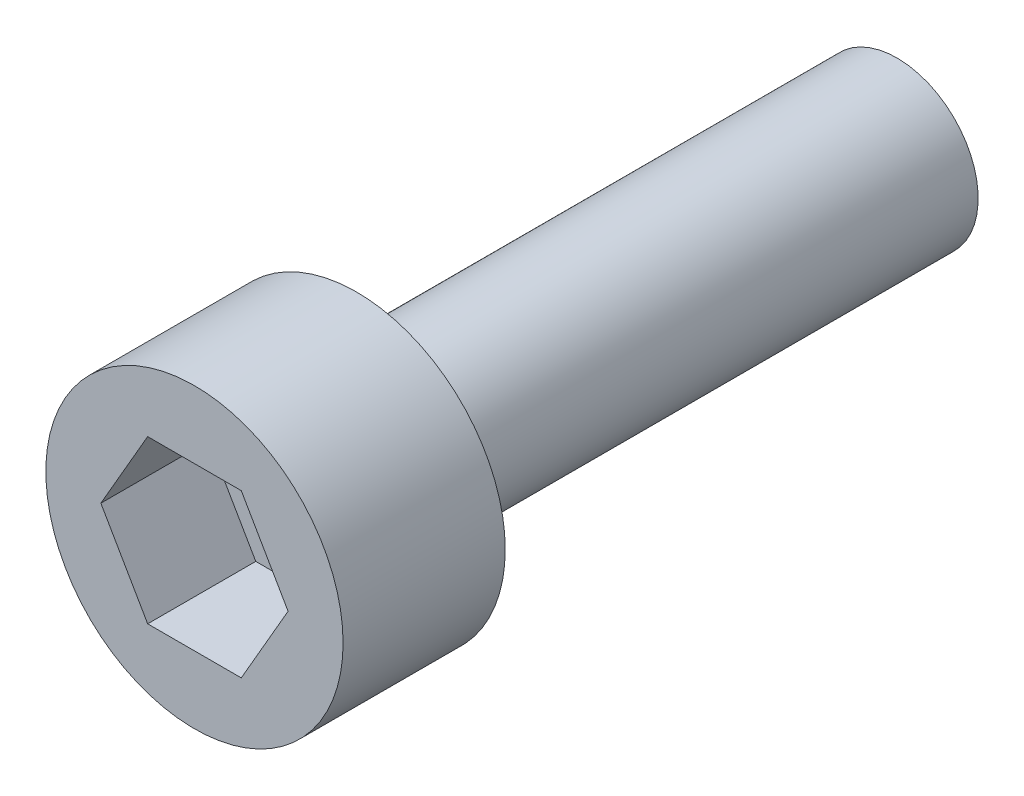
ISO-10303-21;
HEADER;
FILE_DESCRIPTION(('STEP AP214'),'2;1');
FILE_NAME('part.step','',(''),(''),'','','');
FILE_SCHEMA(('AUTOMOTIVE_DESIGN { 1 0 10303 214 1 1 1 1 }'));
ENDSEC;
DATA;
#1=APPLICATION_CONTEXT('core data for automotive mechanical design processes');
#2=APPLICATION_PROTOCOL_DEFINITION('international standard','automotive_design',2000,#1);
#3=PRODUCT_CONTEXT('',#1,'mechanical');
#4=PRODUCT('Part','Part','',(#3));
#5=PRODUCT_RELATED_PRODUCT_CATEGORY('part','',(#4));
#6=PRODUCT_DEFINITION_FORMATION('','',#4);
#7=PRODUCT_DEFINITION_CONTEXT('part definition',#1,'design');
#8=PRODUCT_DEFINITION('design','',#6,#7);
#9=PRODUCT_DEFINITION_SHAPE('','',#8);
#10=(LENGTH_UNIT() NAMED_UNIT(*) SI_UNIT(.MILLI.,.METRE.));
#11=(NAMED_UNIT(*) PLANE_ANGLE_UNIT() SI_UNIT($,.RADIAN.));
#12=(NAMED_UNIT(*) SI_UNIT($,.STERADIAN.) SOLID_ANGLE_UNIT());
#13=UNCERTAINTY_MEASURE_WITH_UNIT(LENGTH_MEASURE(1.E-05),#10,'distance_accuracy_value','');
#14=(GEOMETRIC_REPRESENTATION_CONTEXT(3) GLOBAL_UNCERTAINTY_ASSIGNED_CONTEXT((#13)) GLOBAL_UNIT_ASSIGNED_CONTEXT((#10,
#11,#12)) REPRESENTATION_CONTEXT('',''));
#15=CARTESIAN_POINT('',(0.,0.,0.));
#16=DIRECTION('',(0.,0.,1.));
#17=DIRECTION('',(1.,0.,0.));
#18=AXIS2_PLACEMENT_3D('',#15,#16,#17);
#19=CARTESIAN_POINT('',(0.866025403784438,-1.5,3.));
#20=DIRECTION('',(-0.866025403784439,0.5,0.));
#21=DIRECTION('',(-0.5,-0.866025403784439,0.));
#22=AXIS2_PLACEMENT_3D('',#19,#20,#21);
#23=PLANE('',#22);
#24=DIRECTION('',(0.,0.,-1.));
#25=VECTOR('',#24,1.);
#26=CARTESIAN_POINT('',(1.73205080756888,0.,3.));
#27=LINE('',#26,#25);
#28=CARTESIAN_POINT('',(1.73205080756888,0.,3.));
#29=VERTEX_POINT('',#28);
#30=CARTESIAN_POINT('',(1.73205080756888,0.,1.));
#31=VERTEX_POINT('',#30);
#32=EDGE_CURVE('E119',#29,#31,#27,.T.);
#33=ORIENTED_EDGE('',*,*,#32,.T.);
#34=DIRECTION('',(-0.5,-0.866025403784439,0.));
#35=VECTOR('',#34,1.);
#36=CARTESIAN_POINT('',(1.29903810567666,-0.75,1.));
#37=LINE('',#36,#35);
#38=CARTESIAN_POINT('',(0.866025403784438,-1.5,1.));
#39=VERTEX_POINT('',#38);
#40=EDGE_CURVE('E180',#31,#39,#37,.T.);
#41=ORIENTED_EDGE('',*,*,#40,.T.);
#42=DIRECTION('',(0.,0.,-1.));
#43=VECTOR('',#42,1.);
#44=CARTESIAN_POINT('',(0.866025403784438,-1.5,3.));
#45=LINE('',#44,#43);
#46=CARTESIAN_POINT('',(0.866025403784438,-1.5,3.));
#47=VERTEX_POINT('',#46);
#48=EDGE_CURVE('E197',#47,#39,#45,.T.);
#49=ORIENTED_EDGE('',*,*,#48,.F.);
#50=DIRECTION('',(0.5,0.866025403784439,0.));
#51=VECTOR('',#50,1.);
#52=CARTESIAN_POINT('',(0.866025403784438,-1.5,3.));
#53=LINE('',#52,#51);
#54=EDGE_CURVE('E186',#47,#29,#53,.T.);
#55=ORIENTED_EDGE('',*,*,#54,.T.);
#56=EDGE_LOOP('',(#33,#41,#49,#55));
#57=FACE_BOUND('',#56,.T.);
#58=ADVANCED_FACE('F40',(#57),#23,.T.);
#59=CARTESIAN_POINT('',(1.73205080756888,0.,3.));
#60=DIRECTION('',(-0.866025403784438,-0.5,0.));
#61=DIRECTION('',(0.5,-0.866025403784439,0.));
#62=AXIS2_PLACEMENT_3D('',#59,#60,#61);
#63=PLANE('',#62);
#64=DIRECTION('',(0.,0.,-1.));
#65=VECTOR('',#64,1.);
#66=CARTESIAN_POINT('',(0.866025403784438,1.5,3.));
#67=LINE('',#66,#65);
#68=CARTESIAN_POINT('',(0.866025403784438,1.5,3.));
#69=VERTEX_POINT('',#68);
#70=CARTESIAN_POINT('',(0.866025403784438,1.5,1.));
#71=VERTEX_POINT('',#70);
#72=EDGE_CURVE('E117',#69,#71,#67,.T.);
#73=ORIENTED_EDGE('',*,*,#72,.T.);
#74=DIRECTION('',(0.5,-0.866025403784438,0.));
#75=VECTOR('',#74,1.);
#76=CARTESIAN_POINT('',(1.29903810567666,0.750000000000001,1.));
#77=LINE('',#76,#75);
#78=EDGE_CURVE('E98',#71,#31,#77,.T.);
#79=ORIENTED_EDGE('',*,*,#78,.T.);
#80=ORIENTED_EDGE('',*,*,#32,.F.);
#81=DIRECTION('',(-0.5,0.866025403784438,0.));
#82=VECTOR('',#81,1.);
#83=CARTESIAN_POINT('',(1.73205080756888,0.,3.));
#84=LINE('',#83,#82);
#85=EDGE_CURVE('E188',#29,#69,#84,.T.);
#86=ORIENTED_EDGE('',*,*,#85,.T.);
#87=EDGE_LOOP('',(#73,#79,#80,#86));
#88=FACE_BOUND('',#87,.T.);
#89=ADVANCED_FACE('F145',(#88),#63,.T.);
#90=CARTESIAN_POINT('',(0.866025403784438,1.5,3.));
#91=DIRECTION('',(0.,-1.,0.));
#92=DIRECTION('',(0.,0.,-1.));
#93=AXIS2_PLACEMENT_3D('',#90,#91,#92);
#94=PLANE('',#93);
#95=DIRECTION('',(0.,0.,-1.));
#96=VECTOR('',#95,1.);
#97=CARTESIAN_POINT('',(-0.866025403784439,1.5,3.));
#98=LINE('',#97,#96);
#99=CARTESIAN_POINT('',(-0.866025403784439,1.5,3.));
#100=VERTEX_POINT('',#99);
#101=CARTESIAN_POINT('',(-0.866025403784439,1.5,1.));
#102=VERTEX_POINT('',#101);
#103=EDGE_CURVE('E108',#100,#102,#98,.T.);
#104=ORIENTED_EDGE('',*,*,#103,.T.);
#105=DIRECTION('',(1.,0.,0.));
#106=VECTOR('',#105,1.);
#107=CARTESIAN_POINT('',(0.,1.5,1.));
#108=LINE('',#107,#106);
#109=EDGE_CURVE('E93',#102,#71,#108,.T.);
#110=ORIENTED_EDGE('',*,*,#109,.T.);
#111=ORIENTED_EDGE('',*,*,#72,.F.);
#112=DIRECTION('',(-1.,0.,0.));
#113=VECTOR('',#112,1.);
#114=CARTESIAN_POINT('',(0.866025403784438,1.5,3.));
#115=LINE('',#114,#113);
#116=EDGE_CURVE('E116',#69,#100,#115,.T.);
#117=ORIENTED_EDGE('',*,*,#116,.T.);
#118=EDGE_LOOP('',(#104,#110,#111,#117));
#119=FACE_BOUND('',#118,.T.);
#120=ADVANCED_FACE('F114',(#119),#94,.T.);
#121=CARTESIAN_POINT('',(-0.866025403784439,1.5,3.));
#122=DIRECTION('',(0.866025403784438,-0.5,0.));
#123=DIRECTION('',(0.5,0.866025403784439,0.));
#124=AXIS2_PLACEMENT_3D('',#121,#122,#123);
#125=PLANE('',#124);
#126=DIRECTION('',(0.,0.,-1.));
#127=VECTOR('',#126,1.);
#128=CARTESIAN_POINT('',(-1.73205080756888,0.,3.));
#129=LINE('',#128,#127);
#130=CARTESIAN_POINT('',(-1.73205080756888,0.,3.));
#131=VERTEX_POINT('',#130);
#132=CARTESIAN_POINT('',(-1.73205080756888,0.,1.));
#133=VERTEX_POINT('',#132);
#134=EDGE_CURVE('E111',#131,#133,#129,.T.);
#135=ORIENTED_EDGE('',*,*,#134,.T.);
#136=DIRECTION('',(0.5,0.866025403784439,0.));
#137=VECTOR('',#136,1.);
#138=CARTESIAN_POINT('',(-1.29903810567666,0.75,1.));
#139=LINE('',#138,#137);
#140=EDGE_CURVE('E96',#133,#102,#139,.T.);
#141=ORIENTED_EDGE('',*,*,#140,.T.);
#142=ORIENTED_EDGE('',*,*,#103,.F.);
#143=DIRECTION('',(-0.5,-0.866025403784439,0.));
#144=VECTOR('',#143,1.);
#145=CARTESIAN_POINT('',(-0.866025403784439,1.5,3.));
#146=LINE('',#145,#144);
#147=EDGE_CURVE('E191',#100,#131,#146,.T.);
#148=ORIENTED_EDGE('',*,*,#147,.T.);
#149=EDGE_LOOP('',(#135,#141,#142,#148));
#150=FACE_BOUND('',#149,.T.);
#151=ADVANCED_FACE('F107',(#150),#125,.T.);
#152=CARTESIAN_POINT('',(-1.73205080756888,0.,3.));
#153=DIRECTION('',(0.866025403784439,0.5,0.));
#154=DIRECTION('',(-0.5,0.866025403784439,0.));
#155=AXIS2_PLACEMENT_3D('',#152,#153,#154);
#156=PLANE('',#155);
#157=DIRECTION('',(0.,0.,-1.));
#158=VECTOR('',#157,1.);
#159=CARTESIAN_POINT('',(-0.866025403784438,-1.5,3.));
#160=LINE('',#159,#158);
#161=CARTESIAN_POINT('',(-0.866025403784438,-1.5,3.));
#162=VERTEX_POINT('',#161);
#163=CARTESIAN_POINT('',(-0.866025403784438,-1.5,1.));
#164=VERTEX_POINT('',#163);
#165=EDGE_CURVE('E64',#162,#164,#160,.T.);
#166=ORIENTED_EDGE('',*,*,#165,.T.);
#167=DIRECTION('',(-0.5,0.866025403784439,0.));
#168=VECTOR('',#167,1.);
#169=CARTESIAN_POINT('',(-1.29903810567666,-0.75,1.));
#170=LINE('',#169,#168);
#171=EDGE_CURVE('E57',#164,#133,#170,.T.);
#172=ORIENTED_EDGE('',*,*,#171,.T.);
#173=ORIENTED_EDGE('',*,*,#134,.F.);
#174=DIRECTION('',(0.5,-0.866025403784438,0.));
#175=VECTOR('',#174,1.);
#176=CARTESIAN_POINT('',(-1.73205080756888,0.,3.));
#177=LINE('',#176,#175);
#178=EDGE_CURVE('E193',#131,#162,#177,.T.);
#179=ORIENTED_EDGE('',*,*,#178,.T.);
#180=EDGE_LOOP('',(#166,#172,#173,#179));
#181=FACE_BOUND('',#180,.T.);
#182=ADVANCED_FACE('F158',(#181),#156,.T.);
#183=CARTESIAN_POINT('',(-0.866025403784438,-1.5,3.));
#184=DIRECTION('',(0.,1.,0.));
#185=DIRECTION('',(-1.,0.,0.));
#186=AXIS2_PLACEMENT_3D('',#183,#184,#185);
#187=PLANE('',#186);
#188=ORIENTED_EDGE('',*,*,#48,.T.);
#189=DIRECTION('',(-1.,0.,0.));
#190=VECTOR('',#189,1.);
#191=CARTESIAN_POINT('',(0.,-1.5,1.));
#192=LINE('',#191,#190);
#193=EDGE_CURVE('E183',#39,#164,#192,.T.);
#194=ORIENTED_EDGE('',*,*,#193,.T.);
#195=ORIENTED_EDGE('',*,*,#165,.F.);
#196=DIRECTION('',(1.,0.,0.));
#197=VECTOR('',#196,1.);
#198=CARTESIAN_POINT('',(-0.866025403784438,-1.5,3.));
#199=LINE('',#198,#197);
#200=EDGE_CURVE('E195',#162,#47,#199,.T.);
#201=ORIENTED_EDGE('',*,*,#200,.T.);
#202=EDGE_LOOP('',(#188,#194,#195,#201));
#203=FACE_BOUND('',#202,.T.);
#204=ADVANCED_FACE('F141',(#203),#187,.T.);
#205=CARTESIAN_POINT('',(0.,0.,3.));
#206=DIRECTION('',(0.,0.,1.));
#207=DIRECTION('',(1.,0.,0.));
#208=AXIS2_PLACEMENT_3D('',#205,#206,#207);
#209=PLANE('',#208);
#210=CARTESIAN_POINT('',(0.,0.,3.));
#211=DIRECTION('',(0.,0.,1.));
#212=DIRECTION('',(1.,0.,0.));
#213=AXIS2_PLACEMENT_3D('',#210,#211,#212);
#214=CIRCLE('',#213,2.75);
#215=CARTESIAN_POINT('',(2.75,0.,3.));
#216=VERTEX_POINT('',#215);
#217=EDGE_CURVE('E49',#216,#216,#214,.T.);
#218=ORIENTED_EDGE('',*,*,#217,.T.);
#219=EDGE_LOOP('',(#218));
#220=FACE_BOUND('',#219,.T.);
#221=ORIENTED_EDGE('',*,*,#85,.F.);
#222=ORIENTED_EDGE('',*,*,#54,.F.);
#223=ORIENTED_EDGE('',*,*,#200,.F.);
#224=ORIENTED_EDGE('',*,*,#178,.F.);
#225=ORIENTED_EDGE('',*,*,#147,.F.);
#226=ORIENTED_EDGE('',*,*,#116,.F.);
#227=EDGE_LOOP('',(#221,#222,#223,#224,#225,#226));
#228=FACE_BOUND('',#227,.T.);
#229=ADVANCED_FACE('F134',(#220,#228),#209,.T.);
#230=CARTESIAN_POINT('',(0.,0.,0.));
#231=DIRECTION('',(0.,0.,1.));
#232=DIRECTION('',(1.,0.,0.));
#233=AXIS2_PLACEMENT_3D('',#230,#231,#232);
#234=PLANE('',#233);
#235=CARTESIAN_POINT('',(0.,0.,0.));
#236=DIRECTION('',(0.,0.,-1.));
#237=DIRECTION('',(-1.,0.,0.));
#238=AXIS2_PLACEMENT_3D('',#235,#236,#237);
#239=CIRCLE('',#238,1.5);
#240=CARTESIAN_POINT('',(-1.5,0.,0.));
#241=VERTEX_POINT('',#240);
#242=EDGE_CURVE('E11',#241,#241,#239,.T.);
#243=ORIENTED_EDGE('',*,*,#242,.F.);
#244=EDGE_LOOP('',(#243));
#245=FACE_BOUND('',#244,.T.);
#246=CARTESIAN_POINT('',(0.,0.,0.));
#247=DIRECTION('',(0.,0.,1.));
#248=DIRECTION('',(1.,0.,0.));
#249=AXIS2_PLACEMENT_3D('',#246,#247,#248);
#250=CIRCLE('',#249,2.75);
#251=CARTESIAN_POINT('',(2.75,0.,0.));
#252=VERTEX_POINT('',#251);
#253=EDGE_CURVE('E44',#252,#252,#250,.T.);
#254=ORIENTED_EDGE('',*,*,#253,.F.);
#255=EDGE_LOOP('',(#254));
#256=FACE_BOUND('',#255,.T.);
#257=ADVANCED_FACE('F132',(#245,#256),#234,.F.);
#258=CARTESIAN_POINT('',(0.,0.,3.));
#259=DIRECTION('',(0.,0.,-1.));
#260=DIRECTION('',(-1.,0.,0.));
#261=AXIS2_PLACEMENT_3D('',#258,#259,#260);
#262=CYLINDRICAL_SURFACE('',#261,2.75);
#263=ORIENTED_EDGE('',*,*,#217,.F.);
#264=EDGE_LOOP('',(#263));
#265=FACE_BOUND('',#264,.T.);
#266=ORIENTED_EDGE('',*,*,#253,.T.);
#267=EDGE_LOOP('',(#266));
#268=FACE_BOUND('',#267,.T.);
#269=ADVANCED_FACE('F42',(#265,#268),#262,.T.);
#270=CARTESIAN_POINT('',(0.,0.,1.));
#271=DIRECTION('',(0.,0.,-1.));
#272=DIRECTION('',(-1.,0.,0.));
#273=AXIS2_PLACEMENT_3D('',#270,#271,#272);
#274=PLANE('',#273);
#275=ORIENTED_EDGE('',*,*,#140,.F.);
#276=ORIENTED_EDGE('',*,*,#171,.F.);
#277=ORIENTED_EDGE('',*,*,#193,.F.);
#278=ORIENTED_EDGE('',*,*,#40,.F.);
#279=ORIENTED_EDGE('',*,*,#78,.F.);
#280=ORIENTED_EDGE('',*,*,#109,.F.);
#281=EDGE_LOOP('',(#275,#276,#277,#278,#279,#280));
#282=FACE_BOUND('',#281,.T.);
#283=ADVANCED_FACE('F95',(#282),#274,.F.);
#284=CARTESIAN_POINT('',(0.,0.,-10.));
#285=DIRECTION('',(0.,0.,1.));
#286=DIRECTION('',(1.,0.,0.));
#287=AXIS2_PLACEMENT_3D('',#284,#285,#286);
#288=CYLINDRICAL_SURFACE('',#287,1.5);
#289=CARTESIAN_POINT('',(0.,0.,-10.));
#290=DIRECTION('',(0.,0.,-1.));
#291=DIRECTION('',(-1.,0.,0.));
#292=AXIS2_PLACEMENT_3D('',#289,#290,#291);
#293=CIRCLE('',#292,1.5);
#294=CARTESIAN_POINT('',(-1.5,0.,-10.));
#295=VERTEX_POINT('',#294);
#296=EDGE_CURVE('E112',#295,#295,#293,.T.);
#297=ORIENTED_EDGE('',*,*,#296,.F.);
#298=EDGE_LOOP('',(#297));
#299=FACE_BOUND('',#298,.T.);
#300=ORIENTED_EDGE('',*,*,#242,.T.);
#301=EDGE_LOOP('',(#300));
#302=FACE_BOUND('',#301,.T.);
#303=ADVANCED_FACE('F166',(#299,#302),#288,.T.);
#304=CARTESIAN_POINT('',(0.,0.,-10.));
#305=DIRECTION('',(0.,0.,-1.));
#306=DIRECTION('',(-1.,0.,0.));
#307=AXIS2_PLACEMENT_3D('',#304,#305,#306);
#308=PLANE('',#307);
#309=ORIENTED_EDGE('',*,*,#296,.T.);
#310=EDGE_LOOP('',(#309));
#311=FACE_BOUND('',#310,.T.);
#312=ADVANCED_FACE('F169',(#311),#308,.T.);
#313=CLOSED_SHELL('',(#58,#89,#120,#151,#182,#204,#229,#257,#269,#283,#303,#312));
#314=MANIFOLD_SOLID_BREP('B2',#313);
#315=ADVANCED_BREP_SHAPE_REPRESENTATION('',(#18,#314),#14);
#316=SHAPE_DEFINITION_REPRESENTATION(#9,#315);
ENDSEC;
END-ISO-10303-21;
